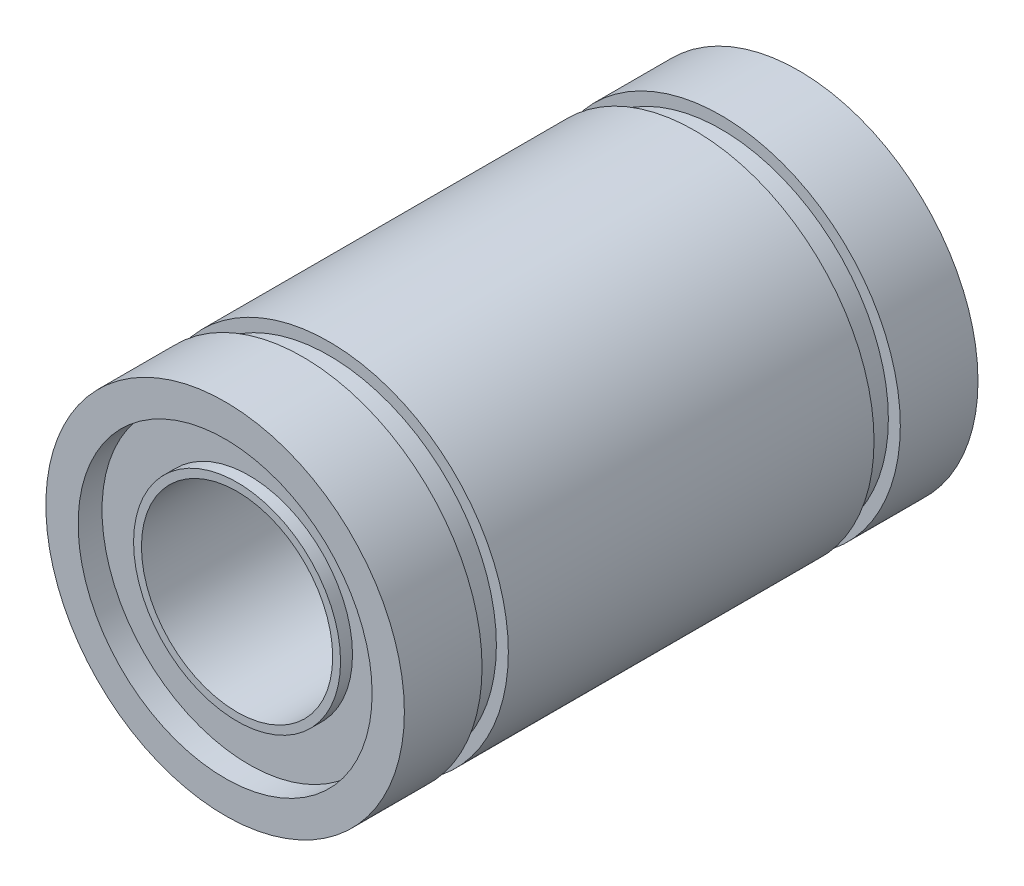
ISO-10303-21;
HEADER;
FILE_DESCRIPTION(('STEP AP214'),'2;1');
FILE_NAME('part.step','',(''),(''),'','','');
FILE_SCHEMA(('AUTOMOTIVE_DESIGN { 1 0 10303 214 1 1 1 1 }'));
ENDSEC;
DATA;
#1=APPLICATION_CONTEXT('core data for automotive mechanical design processes');
#2=APPLICATION_PROTOCOL_DEFINITION('international standard','automotive_design',2000,#1);
#3=PRODUCT_CONTEXT('',#1,'mechanical');
#4=PRODUCT('Part','Part','',(#3));
#5=PRODUCT_RELATED_PRODUCT_CATEGORY('part','',(#4));
#6=PRODUCT_DEFINITION_FORMATION('','',#4);
#7=PRODUCT_DEFINITION_CONTEXT('part definition',#1,'design');
#8=PRODUCT_DEFINITION('design','',#6,#7);
#9=PRODUCT_DEFINITION_SHAPE('','',#8);
#10=(LENGTH_UNIT() NAMED_UNIT(*) SI_UNIT(.MILLI.,.METRE.));
#11=(NAMED_UNIT(*) PLANE_ANGLE_UNIT() SI_UNIT($,.RADIAN.));
#12=(NAMED_UNIT(*) SI_UNIT($,.STERADIAN.) SOLID_ANGLE_UNIT());
#13=UNCERTAINTY_MEASURE_WITH_UNIT(LENGTH_MEASURE(1.E-05),#10,'distance_accuracy_value','');
#14=(GEOMETRIC_REPRESENTATION_CONTEXT(3) GLOBAL_UNCERTAINTY_ASSIGNED_CONTEXT((#13)) GLOBAL_UNIT_ASSIGNED_CONTEXT((#10,
#11,#12)) REPRESENTATION_CONTEXT('',''));
#15=CARTESIAN_POINT('',(0.,0.,0.));
#16=DIRECTION('',(0.,0.,1.));
#17=DIRECTION('',(1.,0.,0.));
#18=AXIS2_PLACEMENT_3D('',#15,#16,#17);
#19=CARTESIAN_POINT('',(0.,0.,0.));
#20=DIRECTION('',(0.,0.,1.));
#21=DIRECTION('',(1.,0.,0.));
#22=AXIS2_PLACEMENT_3D('',#19,#20,#21);
#23=CYLINDRICAL_SURFACE('',#22,4.33);
#24=CARTESIAN_POINT('',(0.,0.,0.500000000000018));
#25=DIRECTION('',(0.,0.,1.));
#26=DIRECTION('',(1.,0.,0.));
#27=AXIS2_PLACEMENT_3D('',#24,#25,#26);
#28=CIRCLE('',#27,4.33);
#29=CARTESIAN_POINT('',(4.33,0.,0.500000000000018));
#30=VERTEX_POINT('',#29);
#31=EDGE_CURVE('E10',#30,#30,#28,.T.);
#32=ORIENTED_EDGE('',*,*,#31,.T.);
#33=EDGE_LOOP('',(#32));
#34=FACE_BOUND('',#33,.T.);
#35=CARTESIAN_POINT('',(0.,0.,1.));
#36=DIRECTION('',(0.,0.,1.));
#37=DIRECTION('',(1.,0.,0.));
#38=AXIS2_PLACEMENT_3D('',#35,#36,#37);
#39=CIRCLE('',#38,4.33);
#40=CARTESIAN_POINT('',(4.33,0.,1.));
#41=VERTEX_POINT('',#40);
#42=EDGE_CURVE('E101',#41,#41,#39,.T.);
#43=ORIENTED_EDGE('',*,*,#42,.F.);
#44=EDGE_LOOP('',(#43));
#45=FACE_BOUND('',#44,.T.);
#46=ADVANCED_FACE('F37',(#34,#45),#23,.T.);
#47=CARTESIAN_POINT('',(4.33,0.,0.500000000000009));
#48=DIRECTION('',(0.,0.,-1.));
#49=DIRECTION('',(-1.,0.,0.));
#50=AXIS2_PLACEMENT_3D('',#47,#48,#49);
#51=PLANE('',#50);
#52=CARTESIAN_POINT('',(0.,0.,0.5));
#53=DIRECTION('',(0.,0.,1.));
#54=DIRECTION('',(1.,0.,0.));
#55=AXIS2_PLACEMENT_3D('',#52,#53,#54);
#56=CIRCLE('',#55,4.);
#57=CARTESIAN_POINT('',(4.,0.,0.5));
#58=VERTEX_POINT('',#57);
#59=EDGE_CURVE('E43',#58,#58,#56,.T.);
#60=ORIENTED_EDGE('',*,*,#59,.T.);
#61=EDGE_LOOP('',(#60));
#62=FACE_BOUND('',#61,.T.);
#63=ORIENTED_EDGE('',*,*,#31,.F.);
#64=EDGE_LOOP('',(#63));
#65=FACE_BOUND('',#64,.T.);
#66=ADVANCED_FACE('F109',(#62,#65),#51,.T.);
#67=CARTESIAN_POINT('',(0.,0.,0.));
#68=DIRECTION('',(0.,0.,1.));
#69=DIRECTION('',(1.,0.,0.));
#70=AXIS2_PLACEMENT_3D('',#67,#68,#69);
#71=CYLINDRICAL_SURFACE('',#70,4.);
#72=CARTESIAN_POINT('',(0.,0.,23.5));
#73=DIRECTION('',(0.,0.,1.));
#74=DIRECTION('',(1.,0.,0.));
#75=AXIS2_PLACEMENT_3D('',#72,#73,#74);
#76=CIRCLE('',#75,4.);
#77=CARTESIAN_POINT('',(4.,0.,23.5));
#78=VERTEX_POINT('',#77);
#79=EDGE_CURVE('E47',#78,#78,#76,.T.);
#80=ORIENTED_EDGE('',*,*,#79,.T.);
#81=EDGE_LOOP('',(#80));
#82=FACE_BOUND('',#81,.T.);
#83=ORIENTED_EDGE('',*,*,#59,.F.);
#84=EDGE_LOOP('',(#83));
#85=FACE_BOUND('',#84,.T.);
#86=ADVANCED_FACE('F113',(#82,#85),#71,.F.);
#87=CARTESIAN_POINT('',(4.,0.,23.5));
#88=DIRECTION('',(0.,0.,1.));
#89=DIRECTION('',(1.,0.,0.));
#90=AXIS2_PLACEMENT_3D('',#87,#88,#89);
#91=PLANE('',#90);
#92=CARTESIAN_POINT('',(0.,0.,23.5));
#93=DIRECTION('',(0.,0.,1.));
#94=DIRECTION('',(1.,0.,0.));
#95=AXIS2_PLACEMENT_3D('',#92,#93,#94);
#96=CIRCLE('',#95,4.33);
#97=CARTESIAN_POINT('',(4.33,0.,23.5));
#98=VERTEX_POINT('',#97);
#99=EDGE_CURVE('E51',#98,#98,#96,.T.);
#100=ORIENTED_EDGE('',*,*,#99,.T.);
#101=EDGE_LOOP('',(#100));
#102=FACE_BOUND('',#101,.T.);
#103=ORIENTED_EDGE('',*,*,#79,.F.);
#104=EDGE_LOOP('',(#103));
#105=FACE_BOUND('',#104,.T.);
#106=ADVANCED_FACE('F117',(#102,#105),#91,.T.);
#107=CARTESIAN_POINT('',(0.,0.,0.));
#108=DIRECTION('',(0.,0.,1.));
#109=DIRECTION('',(1.,0.,0.));
#110=AXIS2_PLACEMENT_3D('',#107,#108,#109);
#111=CYLINDRICAL_SURFACE('',#110,4.33);
#112=CARTESIAN_POINT('',(0.,0.,23.));
#113=DIRECTION('',(0.,0.,1.));
#114=DIRECTION('',(1.,0.,0.));
#115=AXIS2_PLACEMENT_3D('',#112,#113,#114);
#116=CIRCLE('',#115,4.33);
#117=CARTESIAN_POINT('',(4.33,0.,23.));
#118=VERTEX_POINT('',#117);
#119=EDGE_CURVE('E56',#118,#118,#116,.T.);
#120=ORIENTED_EDGE('',*,*,#119,.T.);
#121=EDGE_LOOP('',(#120));
#122=FACE_BOUND('',#121,.T.);
#123=ORIENTED_EDGE('',*,*,#99,.F.);
#124=EDGE_LOOP('',(#123));
#125=FACE_BOUND('',#124,.T.);
#126=ADVANCED_FACE('F124',(#122,#125),#111,.T.);
#127=CARTESIAN_POINT('',(4.33,0.,23.));
#128=DIRECTION('',(0.,0.,1.));
#129=DIRECTION('',(1.,0.,0.));
#130=AXIS2_PLACEMENT_3D('',#127,#128,#129);
#131=PLANE('',#130);
#132=CARTESIAN_POINT('',(0.,0.,23.));
#133=DIRECTION('',(0.,0.,1.));
#134=DIRECTION('',(1.,0.,0.));
#135=AXIS2_PLACEMENT_3D('',#132,#133,#134);
#136=CIRCLE('',#135,6.15);
#137=CARTESIAN_POINT('',(6.15,0.,23.));
#138=VERTEX_POINT('',#137);
#139=EDGE_CURVE('E59',#138,#138,#136,.T.);
#140=ORIENTED_EDGE('',*,*,#139,.T.);
#141=EDGE_LOOP('',(#140));
#142=FACE_BOUND('',#141,.T.);
#143=ORIENTED_EDGE('',*,*,#119,.F.);
#144=EDGE_LOOP('',(#143));
#145=FACE_BOUND('',#144,.T.);
#146=ADVANCED_FACE('F128',(#142,#145),#131,.T.);
#147=CARTESIAN_POINT('',(0.,0.,0.));
#148=DIRECTION('',(0.,0.,1.));
#149=DIRECTION('',(1.,0.,0.));
#150=AXIS2_PLACEMENT_3D('',#147,#148,#149);
#151=CYLINDRICAL_SURFACE('',#150,6.15);
#152=CARTESIAN_POINT('',(0.,0.,24.));
#153=DIRECTION('',(0.,0.,1.));
#154=DIRECTION('',(1.,0.,0.));
#155=AXIS2_PLACEMENT_3D('',#152,#153,#154);
#156=CIRCLE('',#155,6.15);
#157=CARTESIAN_POINT('',(6.15,0.,24.));
#158=VERTEX_POINT('',#157);
#159=EDGE_CURVE('E62',#158,#158,#156,.T.);
#160=ORIENTED_EDGE('',*,*,#159,.T.);
#161=EDGE_LOOP('',(#160));
#162=FACE_BOUND('',#161,.T.);
#163=ORIENTED_EDGE('',*,*,#139,.F.);
#164=EDGE_LOOP('',(#163));
#165=FACE_BOUND('',#164,.T.);
#166=ADVANCED_FACE('F132',(#162,#165),#151,.F.);
#167=CARTESIAN_POINT('',(6.15,0.,24.));
#168=DIRECTION('',(0.,0.,1.));
#169=DIRECTION('',(1.,0.,0.));
#170=AXIS2_PLACEMENT_3D('',#167,#168,#169);
#171=PLANE('',#170);
#172=CARTESIAN_POINT('',(0.,0.,24.));
#173=DIRECTION('',(0.,0.,1.));
#174=DIRECTION('',(1.,0.,0.));
#175=AXIS2_PLACEMENT_3D('',#172,#173,#174);
#176=CIRCLE('',#175,7.5);
#177=CARTESIAN_POINT('',(7.5,0.,24.));
#178=VERTEX_POINT('',#177);
#179=EDGE_CURVE('E65',#178,#178,#176,.T.);
#180=ORIENTED_EDGE('',*,*,#179,.T.);
#181=EDGE_LOOP('',(#180));
#182=FACE_BOUND('',#181,.T.);
#183=ORIENTED_EDGE('',*,*,#159,.F.);
#184=EDGE_LOOP('',(#183));
#185=FACE_BOUND('',#184,.T.);
#186=ADVANCED_FACE('F136',(#182,#185),#171,.T.);
#187=CARTESIAN_POINT('',(0.,0.,0.));
#188=DIRECTION('',(0.,0.,1.));
#189=DIRECTION('',(1.,0.,0.));
#190=AXIS2_PLACEMENT_3D('',#187,#188,#189);
#191=CYLINDRICAL_SURFACE('',#190,7.5);
#192=CARTESIAN_POINT('',(0.,0.,20.75));
#193=DIRECTION('',(0.,0.,1.));
#194=DIRECTION('',(1.,0.,0.));
#195=AXIS2_PLACEMENT_3D('',#192,#193,#194);
#196=CIRCLE('',#195,7.5);
#197=CARTESIAN_POINT('',(7.5,0.,20.75));
#198=VERTEX_POINT('',#197);
#199=EDGE_CURVE('E68',#198,#198,#196,.T.);
#200=ORIENTED_EDGE('',*,*,#199,.T.);
#201=EDGE_LOOP('',(#200));
#202=FACE_BOUND('',#201,.T.);
#203=ORIENTED_EDGE('',*,*,#179,.F.);
#204=EDGE_LOOP('',(#203));
#205=FACE_BOUND('',#204,.T.);
#206=ADVANCED_FACE('F140',(#202,#205),#191,.T.);
#207=CARTESIAN_POINT('',(7.5,0.,20.75));
#208=DIRECTION('',(0.,0.,-1.));
#209=DIRECTION('',(-1.,0.,0.));
#210=AXIS2_PLACEMENT_3D('',#207,#208,#209);
#211=PLANE('',#210);
#212=CARTESIAN_POINT('',(0.,0.,20.75));
#213=DIRECTION('',(0.,0.,1.));
#214=DIRECTION('',(1.,0.,0.));
#215=AXIS2_PLACEMENT_3D('',#212,#213,#214);
#216=CIRCLE('',#215,7.);
#217=CARTESIAN_POINT('',(7.,0.,20.75));
#218=VERTEX_POINT('',#217);
#219=EDGE_CURVE('E71',#218,#218,#216,.T.);
#220=ORIENTED_EDGE('',*,*,#219,.T.);
#221=EDGE_LOOP('',(#220));
#222=FACE_BOUND('',#221,.T.);
#223=ORIENTED_EDGE('',*,*,#199,.F.);
#224=EDGE_LOOP('',(#223));
#225=FACE_BOUND('',#224,.T.);
#226=ADVANCED_FACE('F144',(#222,#225),#211,.T.);
#227=CARTESIAN_POINT('',(0.,0.,0.));
#228=DIRECTION('',(0.,0.,1.));
#229=DIRECTION('',(1.,0.,0.));
#230=AXIS2_PLACEMENT_3D('',#227,#228,#229);
#231=CYLINDRICAL_SURFACE('',#230,7.);
#232=CARTESIAN_POINT('',(0.,0.,19.65));
#233=DIRECTION('',(0.,0.,1.));
#234=DIRECTION('',(1.,0.,0.));
#235=AXIS2_PLACEMENT_3D('',#232,#233,#234);
#236=CIRCLE('',#235,7.);
#237=CARTESIAN_POINT('',(7.,0.,19.65));
#238=VERTEX_POINT('',#237);
#239=EDGE_CURVE('E74',#238,#238,#236,.T.);
#240=ORIENTED_EDGE('',*,*,#239,.T.);
#241=EDGE_LOOP('',(#240));
#242=FACE_BOUND('',#241,.T.);
#243=ORIENTED_EDGE('',*,*,#219,.F.);
#244=EDGE_LOOP('',(#243));
#245=FACE_BOUND('',#244,.T.);
#246=ADVANCED_FACE('F148',(#242,#245),#231,.T.);
#247=CARTESIAN_POINT('',(7.,0.,19.65));
#248=DIRECTION('',(0.,0.,1.));
#249=DIRECTION('',(1.,0.,0.));
#250=AXIS2_PLACEMENT_3D('',#247,#248,#249);
#251=PLANE('',#250);
#252=CARTESIAN_POINT('',(0.,0.,19.65));
#253=DIRECTION('',(0.,0.,1.));
#254=DIRECTION('',(1.,0.,0.));
#255=AXIS2_PLACEMENT_3D('',#252,#253,#254);
#256=CIRCLE('',#255,7.5);
#257=CARTESIAN_POINT('',(7.5,0.,19.65));
#258=VERTEX_POINT('',#257);
#259=EDGE_CURVE('E77',#258,#258,#256,.T.);
#260=ORIENTED_EDGE('',*,*,#259,.T.);
#261=EDGE_LOOP('',(#260));
#262=FACE_BOUND('',#261,.T.);
#263=ORIENTED_EDGE('',*,*,#239,.F.);
#264=EDGE_LOOP('',(#263));
#265=FACE_BOUND('',#264,.T.);
#266=ADVANCED_FACE('F152',(#262,#265),#251,.T.);
#267=CARTESIAN_POINT('',(0.,0.,0.));
#268=DIRECTION('',(0.,0.,1.));
#269=DIRECTION('',(1.,0.,0.));
#270=AXIS2_PLACEMENT_3D('',#267,#268,#269);
#271=CYLINDRICAL_SURFACE('',#270,7.5);
#272=CARTESIAN_POINT('',(0.,0.,4.34999999999996));
#273=DIRECTION('',(0.,0.,1.));
#274=DIRECTION('',(1.,0.,0.));
#275=AXIS2_PLACEMENT_3D('',#272,#273,#274);
#276=CIRCLE('',#275,7.5);
#277=CARTESIAN_POINT('',(7.5,0.,4.34999999999996));
#278=VERTEX_POINT('',#277);
#279=EDGE_CURVE('E80',#278,#278,#276,.T.);
#280=ORIENTED_EDGE('',*,*,#279,.T.);
#281=EDGE_LOOP('',(#280));
#282=FACE_BOUND('',#281,.T.);
#283=ORIENTED_EDGE('',*,*,#259,.F.);
#284=EDGE_LOOP('',(#283));
#285=FACE_BOUND('',#284,.T.);
#286=ADVANCED_FACE('F156',(#282,#285),#271,.T.);
#287=CARTESIAN_POINT('',(7.5,0.,4.34999999999998));
#288=DIRECTION('',(0.,0.,-1.));
#289=DIRECTION('',(-1.,0.,0.));
#290=AXIS2_PLACEMENT_3D('',#287,#288,#289);
#291=PLANE('',#290);
#292=CARTESIAN_POINT('',(0.,0.,4.35));
#293=DIRECTION('',(0.,0.,1.));
#294=DIRECTION('',(1.,0.,0.));
#295=AXIS2_PLACEMENT_3D('',#292,#293,#294);
#296=CIRCLE('',#295,7.);
#297=CARTESIAN_POINT('',(7.,0.,4.35));
#298=VERTEX_POINT('',#297);
#299=EDGE_CURVE('E83',#298,#298,#296,.T.);
#300=ORIENTED_EDGE('',*,*,#299,.T.);
#301=EDGE_LOOP('',(#300));
#302=FACE_BOUND('',#301,.T.);
#303=ORIENTED_EDGE('',*,*,#279,.F.);
#304=EDGE_LOOP('',(#303));
#305=FACE_BOUND('',#304,.T.);
#306=ADVANCED_FACE('F160',(#302,#305),#291,.T.);
#307=CARTESIAN_POINT('',(0.,0.,0.));
#308=DIRECTION('',(0.,0.,1.));
#309=DIRECTION('',(1.,0.,0.));
#310=AXIS2_PLACEMENT_3D('',#307,#308,#309);
#311=CYLINDRICAL_SURFACE('',#310,7.);
#312=CARTESIAN_POINT('',(0.,0.,3.24999999999997));
#313=DIRECTION('',(0.,0.,1.));
#314=DIRECTION('',(1.,0.,0.));
#315=AXIS2_PLACEMENT_3D('',#312,#313,#314);
#316=CIRCLE('',#315,7.);
#317=CARTESIAN_POINT('',(7.,0.,3.24999999999997));
#318=VERTEX_POINT('',#317);
#319=EDGE_CURVE('E86',#318,#318,#316,.T.);
#320=ORIENTED_EDGE('',*,*,#319,.T.);
#321=EDGE_LOOP('',(#320));
#322=FACE_BOUND('',#321,.T.);
#323=ORIENTED_EDGE('',*,*,#299,.F.);
#324=EDGE_LOOP('',(#323));
#325=FACE_BOUND('',#324,.T.);
#326=ADVANCED_FACE('F164',(#322,#325),#311,.T.);
#327=CARTESIAN_POINT('',(7.,0.,3.24999999999998));
#328=DIRECTION('',(0.,0.,1.));
#329=DIRECTION('',(1.,0.,0.));
#330=AXIS2_PLACEMENT_3D('',#327,#328,#329);
#331=PLANE('',#330);
#332=CARTESIAN_POINT('',(0.,0.,3.25));
#333=DIRECTION('',(0.,0.,1.));
#334=DIRECTION('',(1.,0.,0.));
#335=AXIS2_PLACEMENT_3D('',#332,#333,#334);
#336=CIRCLE('',#335,7.5);
#337=CARTESIAN_POINT('',(7.5,0.,3.25));
#338=VERTEX_POINT('',#337);
#339=EDGE_CURVE('E89',#338,#338,#336,.T.);
#340=ORIENTED_EDGE('',*,*,#339,.T.);
#341=EDGE_LOOP('',(#340));
#342=FACE_BOUND('',#341,.T.);
#343=ORIENTED_EDGE('',*,*,#319,.F.);
#344=EDGE_LOOP('',(#343));
#345=FACE_BOUND('',#344,.T.);
#346=ADVANCED_FACE('F168',(#342,#345),#331,.T.);
#347=CARTESIAN_POINT('',(0.,0.,0.));
#348=DIRECTION('',(0.,0.,1.));
#349=DIRECTION('',(1.,0.,0.));
#350=AXIS2_PLACEMENT_3D('',#347,#348,#349);
#351=CYLINDRICAL_SURFACE('',#350,7.5);
#352=CARTESIAN_POINT('',(0.,0.,0.));
#353=DIRECTION('',(0.,0.,1.));
#354=DIRECTION('',(1.,0.,0.));
#355=AXIS2_PLACEMENT_3D('',#352,#353,#354);
#356=CIRCLE('',#355,7.5);
#357=CARTESIAN_POINT('',(7.5,0.,0.));
#358=VERTEX_POINT('',#357);
#359=EDGE_CURVE('E92',#358,#358,#356,.T.);
#360=ORIENTED_EDGE('',*,*,#359,.T.);
#361=EDGE_LOOP('',(#360));
#362=FACE_BOUND('',#361,.T.);
#363=ORIENTED_EDGE('',*,*,#339,.F.);
#364=EDGE_LOOP('',(#363));
#365=FACE_BOUND('',#364,.T.);
#366=ADVANCED_FACE('F172',(#362,#365),#351,.T.);
#367=CARTESIAN_POINT('',(7.5,0.,0.));
#368=DIRECTION('',(0.,0.,-1.));
#369=DIRECTION('',(-1.,0.,0.));
#370=AXIS2_PLACEMENT_3D('',#367,#368,#369);
#371=PLANE('',#370);
#372=CARTESIAN_POINT('',(0.,0.,0.));
#373=DIRECTION('',(0.,0.,1.));
#374=DIRECTION('',(1.,0.,0.));
#375=AXIS2_PLACEMENT_3D('',#372,#373,#374);
#376=CIRCLE('',#375,6.15);
#377=CARTESIAN_POINT('',(6.15,0.,0.));
#378=VERTEX_POINT('',#377);
#379=EDGE_CURVE('E95',#378,#378,#376,.T.);
#380=ORIENTED_EDGE('',*,*,#379,.T.);
#381=EDGE_LOOP('',(#380));
#382=FACE_BOUND('',#381,.T.);
#383=ORIENTED_EDGE('',*,*,#359,.F.);
#384=EDGE_LOOP('',(#383));
#385=FACE_BOUND('',#384,.T.);
#386=ADVANCED_FACE('F176',(#382,#385),#371,.T.);
#387=CARTESIAN_POINT('',(0.,0.,0.));
#388=DIRECTION('',(0.,0.,1.));
#389=DIRECTION('',(1.,0.,0.));
#390=AXIS2_PLACEMENT_3D('',#387,#388,#389);
#391=CYLINDRICAL_SURFACE('',#390,6.15);
#392=CARTESIAN_POINT('',(0.,0.,0.999999999999974));
#393=DIRECTION('',(0.,0.,1.));
#394=DIRECTION('',(1.,0.,0.));
#395=AXIS2_PLACEMENT_3D('',#392,#393,#394);
#396=CIRCLE('',#395,6.15);
#397=CARTESIAN_POINT('',(6.15,0.,0.999999999999974));
#398=VERTEX_POINT('',#397);
#399=EDGE_CURVE('E98',#398,#398,#396,.T.);
#400=ORIENTED_EDGE('',*,*,#399,.T.);
#401=EDGE_LOOP('',(#400));
#402=FACE_BOUND('',#401,.T.);
#403=ORIENTED_EDGE('',*,*,#379,.F.);
#404=EDGE_LOOP('',(#403));
#405=FACE_BOUND('',#404,.T.);
#406=ADVANCED_FACE('F180',(#402,#405),#391,.F.);
#407=CARTESIAN_POINT('',(6.15,0.,0.999999999999987));
#408=DIRECTION('',(0.,0.,-1.));
#409=DIRECTION('',(-1.,0.,0.));
#410=AXIS2_PLACEMENT_3D('',#407,#408,#409);
#411=PLANE('',#410);
#412=ORIENTED_EDGE('',*,*,#42,.T.);
#413=EDGE_LOOP('',(#412));
#414=FACE_BOUND('',#413,.T.);
#415=ORIENTED_EDGE('',*,*,#399,.F.);
#416=EDGE_LOOP('',(#415));
#417=FACE_BOUND('',#416,.T.);
#418=ADVANCED_FACE('F105',(#414,#417),#411,.T.);
#419=CLOSED_SHELL('',(#46,#66,#86,#106,#126,#146,#166,#186,#206,#226,#246,#266,#286,#306,#326,
#346,#366,#386,#406,#418));
#420=MANIFOLD_SOLID_BREP('B2',#419);
#421=ADVANCED_BREP_SHAPE_REPRESENTATION('',(#18,#420),#14);
#422=SHAPE_DEFINITION_REPRESENTATION(#9,#421);
ENDSEC;
END-ISO-10303-21;
